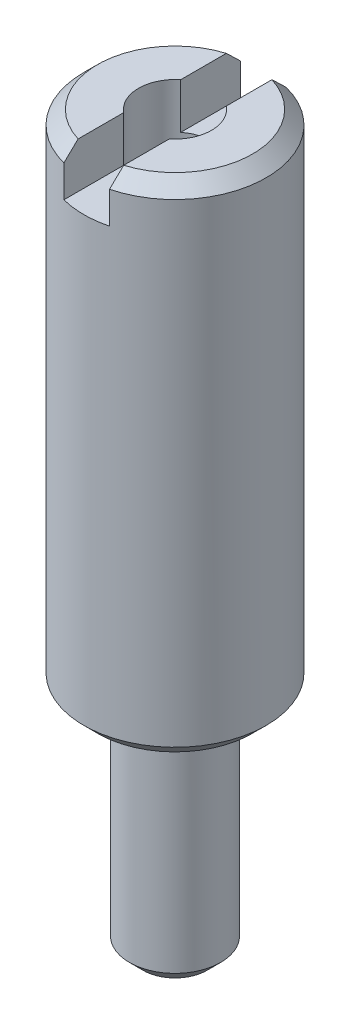
ISO-10303-21;
HEADER;
FILE_DESCRIPTION(('STEP AP214'),'2;1');
FILE_NAME('part.step','',(''),(''),'','','');
FILE_SCHEMA(('AUTOMOTIVE_DESIGN { 1 0 10303 214 1 1 1 1 }'));
ENDSEC;
DATA;
#1=APPLICATION_CONTEXT('core data for automotive mechanical design processes');
#2=APPLICATION_PROTOCOL_DEFINITION('international standard','automotive_design',2000,#1);
#3=PRODUCT_CONTEXT('',#1,'mechanical');
#4=PRODUCT('Part','Part','',(#3));
#5=PRODUCT_RELATED_PRODUCT_CATEGORY('part','',(#4));
#6=PRODUCT_DEFINITION_FORMATION('','',#4);
#7=PRODUCT_DEFINITION_CONTEXT('part definition',#1,'design');
#8=PRODUCT_DEFINITION('design','',#6,#7);
#9=PRODUCT_DEFINITION_SHAPE('','',#8);
#10=(LENGTH_UNIT() NAMED_UNIT(*) SI_UNIT(.MILLI.,.METRE.));
#11=(NAMED_UNIT(*) PLANE_ANGLE_UNIT() SI_UNIT($,.RADIAN.));
#12=(NAMED_UNIT(*) SI_UNIT($,.STERADIAN.) SOLID_ANGLE_UNIT());
#13=UNCERTAINTY_MEASURE_WITH_UNIT(LENGTH_MEASURE(1.E-05),#10,'distance_accuracy_value','');
#14=(GEOMETRIC_REPRESENTATION_CONTEXT(3) GLOBAL_UNCERTAINTY_ASSIGNED_CONTEXT((#13)) GLOBAL_UNIT_ASSIGNED_CONTEXT((#10,
#11,#12)) REPRESENTATION_CONTEXT('',''));
#15=CARTESIAN_POINT('',(0.,0.,0.));
#16=DIRECTION('',(0.,0.,1.));
#17=DIRECTION('',(1.,0.,0.));
#18=AXIS2_PLACEMENT_3D('',#15,#16,#17);
#19=CARTESIAN_POINT('',(0.499999999999999,10.,1.93649167310371));
#20=DIRECTION('',(1.,0.,0.));
#21=DIRECTION('',(0.,1.,0.));
#22=AXIS2_PLACEMENT_3D('',#19,#20,#21);
#23=PLANE('',#22);
#24=DIRECTION('',(0.,0.,-1.));
#25=VECTOR('',#24,1.);
#26=CARTESIAN_POINT('',(0.499999999999999,10.,1.93649167310371));
#27=LINE('',#26,#25);
#28=CARTESIAN_POINT('',(0.499999999999999,10.,-0.624499799839825));
#29=VERTEX_POINT('',#28);
#30=CARTESIAN_POINT('',(0.499999999999999,10.,-1.93649167310371));
#31=VERTEX_POINT('',#30);
#32=EDGE_CURVE('E160',#29,#31,#27,.T.);
#33=ORIENTED_EDGE('',*,*,#32,.F.);
#34=DIRECTION('',(0.,1.,0.));
#35=VECTOR('',#34,1.);
#36=CARTESIAN_POINT('',(0.499999999999999,11.,-0.624499799839825));
#37=LINE('',#36,#35);
#38=CARTESIAN_POINT('',(0.5,11.,-0.624499799839826));
#39=VERTEX_POINT('',#38);
#40=EDGE_CURVE('E139',#29,#39,#37,.T.);
#41=ORIENTED_EDGE('',*,*,#40,.T.);
#42=DIRECTION('',(0.,0.,-1.));
#43=VECTOR('',#42,1.);
#44=CARTESIAN_POINT('',(0.499999999999999,11.,1.93649167310371));
#45=LINE('',#44,#43);
#46=CARTESIAN_POINT('',(0.499999999999999,11.,-1.62480768092719));
#47=VERTEX_POINT('',#46);
#48=EDGE_CURVE('E168',#39,#47,#45,.T.);
#49=ORIENTED_EDGE('',*,*,#48,.T.);
#50=CARTESIAN_POINT('',(0.499999999999999,10.6993222202608,1.93719167310371));
#51=CARTESIAN_POINT('',(0.499999999999999,10.7428770963282,1.89220755731253));
#52=CARTESIAN_POINT('',(0.499999999999999,10.7863850679883,1.84717789776602));
#53=CARTESIAN_POINT('',(0.499999999999999,10.8732800817423,1.75700089805375));
#54=CARTESIAN_POINT('',(0.499999999999999,10.9166671221929,1.71185355630471));
#55=CARTESIAN_POINT('',(0.499999999999999,11.0466536550705,1.5761455190196));
#56=CARTESIAN_POINT('',(0.499999999999999,11.1330289631519,1.48536991040214));
#57=CARTESIAN_POINT('',(0.499999999999999,11.3030075205815,1.30480557239158));
#58=CARTESIAN_POINT('',(0.499999999999999,11.3866309472492,1.21503596615476));
#59=CARTESIAN_POINT('',(0.499999999999999,11.5107449857525,1.07919265928037));
#60=CARTESIAN_POINT('',(0.499999999999999,11.5518912702344,1.03371895804912));
#61=CARTESIAN_POINT('',(0.499999999999999,11.6335486851726,0.942205177900432));
#62=CARTESIAN_POINT('',(0.499999999999999,11.6740598410681,0.89616512180009));
#63=CARTESIAN_POINT('',(0.499999999999999,11.7374263185076,0.822638791086007));
#64=CARTESIAN_POINT('',(0.499999999999999,11.760597051512,0.79542468062398));
#65=CARTESIAN_POINT('',(0.499999999999999,11.806514355603,0.740635407506711));
#66=CARTESIAN_POINT('',(0.499999999999999,11.8292608851979,0.713060209977462));
#67=CARTESIAN_POINT('',(0.499999999999999,11.8744284644168,0.65714775486821));
#68=CARTESIAN_POINT('',(0.499999999999999,11.8968433281294,0.628805479844934));
#69=CARTESIAN_POINT('',(0.499999999999999,11.9408688783991,0.571504126027372));
#70=CARTESIAN_POINT('',(0.499999999999999,11.9624796490216,0.54254511221159));
#71=CARTESIAN_POINT('',(0.499999999999999,12.0048874562061,0.483338483705217));
#72=CARTESIAN_POINT('',(0.499999999999999,12.0256663842913,0.453077774560379));
#73=CARTESIAN_POINT('',(0.499999999999999,12.0654891917586,0.391359158947764));
#74=CARTESIAN_POINT('',(0.499999999999999,12.0845307016714,0.359899698089013));
#75=CARTESIAN_POINT('',(0.499999999999999,12.1196400462383,0.295850013529539));
#76=CARTESIAN_POINT('',(0.499999999999999,12.1357429160322,0.26327948950806));
#77=CARTESIAN_POINT('',(0.499999999999999,12.1636662142921,0.19639463163883));
#78=CARTESIAN_POINT('',(0.499999999999999,12.1755011286258,0.162086655902528));
#79=CARTESIAN_POINT('',(0.499999999999999,12.1922007392071,0.0941284801233588));
#80=CARTESIAN_POINT('',(0.499999999999999,12.1974765424996,0.0605862018063697));
#81=CARTESIAN_POINT('',(0.499999999999999,12.2010782898095,-0.00680451992639368));
#82=CARTESIAN_POINT('',(0.499999999999999,12.1994236436485,-0.0406518437095688));
#83=CARTESIAN_POINT('',(0.499999999999999,12.1897268566969,-0.107052522281991));
#84=CARTESIAN_POINT('',(0.499999999999999,12.181740214835,-0.139614550962263));
#85=CARTESIAN_POINT('',(0.499999999999999,12.1662691375474,-0.187346768125278));
#86=CARTESIAN_POINT('',(0.499999999999999,12.1605065004629,-0.203120360291453));
#87=CARTESIAN_POINT('',(0.499999999999999,12.1480179553612,-0.234279759514601));
#88=CARTESIAN_POINT('',(0.499999999999999,12.1412922505277,-0.249665647564517));
#89=CARTESIAN_POINT('',(0.499999999999999,12.1194868491377,-0.296258315724647));
#90=CARTESIAN_POINT('',(0.499999999999999,12.1031372601359,-0.326867130076432));
#91=CARTESIAN_POINT('',(0.499999999999999,12.068290057956,-0.386849084067541));
#92=CARTESIAN_POINT('',(0.499999999999999,12.0497897379324,-0.416220601772913));
#93=CARTESIAN_POINT('',(0.499999999999999,12.0112948160351,-0.474113366103736));
#94=CARTESIAN_POINT('',(0.499999999999999,11.9912950245838,-0.50263113209238));
#95=CARTESIAN_POINT('',(0.499999999999999,11.9503000497839,-0.558945490941787));
#96=CARTESIAN_POINT('',(0.499999999999999,11.9293046262122,-0.586741907228485));
#97=CARTESIAN_POINT('',(0.499999999999999,11.8647235437807,-0.670031245753593));
#98=CARTESIAN_POINT('',(0.499999999999999,11.8200590176524,-0.724683977764773));
#99=CARTESIAN_POINT('',(0.499999999999999,11.7292857942069,-0.83253300409101));
#100=CARTESIAN_POINT('',(0.499999999999999,11.6831807608361,-0.88573243622847));
#101=CARTESIAN_POINT('',(0.499999999999999,11.5595379698501,-1.02585008394259));
#102=CARTESIAN_POINT('',(0.499999999999999,11.4811811112463,-1.11204372732044));
#103=CARTESIAN_POINT('',(0.499999999999999,11.3231036915184,-1.28331372296256));
#104=CARTESIAN_POINT('',(0.499999999999999,11.2433818717758,-1.36838890021735));
#105=CARTESIAN_POINT('',(0.499999999999999,11.0864558535523,-1.53435066462907));
#106=CARTESIAN_POINT('',(0.499999999999999,11.009282195277,-1.61526614566013));
#107=CARTESIAN_POINT('',(0.499999999999999,10.8545523125568,-1.77655732792672));
#108=CARTESIAN_POINT('',(0.499999999999999,10.776996612147,-1.85693353141052));
#109=CARTESIAN_POINT('',(0.499999999999999,10.6993222202608,-1.93719167310371));
#110=B_SPLINE_CURVE_WITH_KNOTS('',3,(#50,#51,#52,#53,#54,#55,#56,#57,#58,#59,#60,#61,#62,#63,
#64,#65,#66,#67,#68,#69,#70,#71,#72,#73,#74,#75,#76,#77,#78,#79,#80,#81,#82,#83,#84,#85,#86,#87,
#88,#89,#90,#91,#92,#93,#94,#95,#96,#97,#98,#99,#100,#101,#102,#103,#104,#105,#106,#107,#108,
#109),.UNSPECIFIED.,.F.,.F.,(4,2,2,2,2,2,2,2,2,2,2,2,2,2,2,2,2,2,2,2,2,2,2,2,2,2,2,2,2,4),(0.,
0.187844133139613,0.375690806679857,0.751597779356548,1.11963529141073,1.3036097191791,
1.48757675917451,1.59479959408427,1.7020328621595,1.81042655513669,1.91880888389714,
2.02889325193391,2.13912557521411,2.24794285087427,2.35638723428054,2.45762158358788,
2.55857259991711,2.6586484500379,2.70900514357445,2.75935122868917,2.86330447784821,
2.9673900054883,3.07185406100689,3.17634345084378,3.38802536739635,3.59920682721264,
3.94863278075062,4.2984004337216,4.63384936785084,4.96892335170389),.UNSPECIFIED.);
#111=CARTESIAN_POINT('',(0.499999999999999,10.7,-1.93649167310371));
#112=VERTEX_POINT('',#111);
#113=EDGE_CURVE('E212',#47,#112,#110,.T.);
#114=ORIENTED_EDGE('',*,*,#113,.T.);
#115=DIRECTION('',(0.,1.,0.));
#116=VECTOR('',#115,1.);
#117=CARTESIAN_POINT('',(0.499999999999999,10.,-1.93649167310371));
#118=LINE('',#117,#116);
#119=EDGE_CURVE('E171',#31,#112,#118,.T.);
#120=ORIENTED_EDGE('',*,*,#119,.F.);
#121=EDGE_LOOP('',(#33,#41,#49,#114,#120));
#122=FACE_BOUND('',#121,.T.);
#123=ADVANCED_FACE('F49',(#122),#23,.F.);
#124=CARTESIAN_POINT('',(0.,10.,0.));
#125=DIRECTION('',(0.,1.,0.));
#126=DIRECTION('',(-1.,0.,0.));
#127=AXIS2_PLACEMENT_3D('',#124,#125,#126);
#128=PLANE('',#127);
#129=CARTESIAN_POINT('',(0.,10.,0.));
#130=DIRECTION('',(0.,1.,0.));
#131=DIRECTION('',(-1.,0.,0.));
#132=AXIS2_PLACEMENT_3D('',#129,#130,#131);
#133=CIRCLE('',#132,0.799999999999989);
#134=CARTESIAN_POINT('',(-0.500000000000001,10.,0.624499799839825));
#135=VERTEX_POINT('',#134);
#136=CARTESIAN_POINT('',(0.499999999999999,10.,0.624499799839825));
#137=VERTEX_POINT('',#136);
#138=EDGE_CURVE('E141',#135,#137,#133,.T.);
#139=ORIENTED_EDGE('',*,*,#138,.F.);
#140=DIRECTION('',(0.,0.,1.));
#141=VECTOR('',#140,1.);
#142=CARTESIAN_POINT('',(-0.500000000000001,10.,1.93649167310371));
#143=LINE('',#142,#141);
#144=CARTESIAN_POINT('',(-0.500000000000001,10.,1.93649167310371));
#145=VERTEX_POINT('',#144);
#146=EDGE_CURVE('E153',#135,#145,#143,.T.);
#147=ORIENTED_EDGE('',*,*,#146,.T.);
#148=CARTESIAN_POINT('',(0.,10.,0.));
#149=DIRECTION('',(0.,1.,0.));
#150=DIRECTION('',(-1.,0.,0.));
#151=AXIS2_PLACEMENT_3D('',#148,#149,#150);
#152=CIRCLE('',#151,2.);
#153=CARTESIAN_POINT('',(0.499999999999999,10.,1.93649167310371));
#154=VERTEX_POINT('',#153);
#155=EDGE_CURVE('E158',#145,#154,#152,.T.);
#156=ORIENTED_EDGE('',*,*,#155,.T.);
#157=EDGE_CURVE('E161',#154,#137,#27,.T.);
#158=ORIENTED_EDGE('',*,*,#157,.T.);
#159=EDGE_LOOP('',(#139,#147,#156,#158));
#160=FACE_BOUND('',#159,.T.);
#161=ADVANCED_FACE('F257',(#160),#128,.T.);
#162=CARTESIAN_POINT('',(-0.500000000000001,10.,1.93649167310371));
#163=DIRECTION('',(-1.,0.,0.));
#164=DIRECTION('',(0.,-1.,0.));
#165=AXIS2_PLACEMENT_3D('',#162,#163,#164);
#166=PLANE('',#165);
#167=ORIENTED_EDGE('',*,*,#146,.F.);
#168=DIRECTION('',(0.,1.,0.));
#169=VECTOR('',#168,1.);
#170=CARTESIAN_POINT('',(-0.500000000000001,11.,0.624499799839825));
#171=LINE('',#170,#169);
#172=CARTESIAN_POINT('',(-0.500000000000002,11.,0.624499799839826));
#173=VERTEX_POINT('',#172);
#174=EDGE_CURVE('E12',#135,#173,#171,.T.);
#175=ORIENTED_EDGE('',*,*,#174,.T.);
#176=DIRECTION('',(0.,0.,1.));
#177=VECTOR('',#176,1.);
#178=CARTESIAN_POINT('',(-0.500000000000001,11.,1.93649167310371));
#179=LINE('',#178,#177);
#180=CARTESIAN_POINT('',(-0.500000000000001,11.,1.62480768092719));
#181=VERTEX_POINT('',#180);
#182=EDGE_CURVE('E72',#173,#181,#179,.T.);
#183=ORIENTED_EDGE('',*,*,#182,.T.);
#184=CARTESIAN_POINT('',(-0.500000000000001,10.6993222202608,-1.93719167310371));
#185=CARTESIAN_POINT('',(-0.500000000000001,10.7428770963282,-1.89220755731253));
#186=CARTESIAN_POINT('',(-0.500000000000001,10.7863850679883,-1.84717789776602));
#187=CARTESIAN_POINT('',(-0.500000000000001,10.8732800817423,-1.75700089805375));
#188=CARTESIAN_POINT('',(-0.500000000000001,10.9166671221929,-1.71185355630471));
#189=CARTESIAN_POINT('',(-0.500000000000001,11.0466536550705,-1.5761455190196));
#190=CARTESIAN_POINT('',(-0.500000000000001,11.1330289631519,-1.48536991040214));
#191=CARTESIAN_POINT('',(-0.500000000000001,11.3030075205815,-1.30480557239159));
#192=CARTESIAN_POINT('',(-0.500000000000001,11.3866309472492,-1.21503596615477));
#193=CARTESIAN_POINT('',(-0.500000000000001,11.5107449857524,-1.07919265928038));
#194=CARTESIAN_POINT('',(-0.500000000000001,11.5518912702344,-1.03371895804913));
#195=CARTESIAN_POINT('',(-0.500000000000001,11.6335486851726,-0.942205177900439));
#196=CARTESIAN_POINT('',(-0.500000000000001,11.6740598410681,-0.896165121800097));
#197=CARTESIAN_POINT('',(-0.500000000000001,11.7374263185076,-0.822638791086016));
#198=CARTESIAN_POINT('',(-0.500000000000001,11.7605970515119,-0.79542468062399));
#199=CARTESIAN_POINT('',(-0.500000000000001,11.806514355603,-0.740635407506721));
#200=CARTESIAN_POINT('',(-0.500000000000001,11.8292608851979,-0.713060209977471));
#201=CARTESIAN_POINT('',(-0.500000000000001,11.8744284644168,-0.657147754868218));
#202=CARTESIAN_POINT('',(-0.500000000000001,11.8968433281293,-0.628805479844943));
#203=CARTESIAN_POINT('',(-0.500000000000001,11.9408688783991,-0.571504126027379));
#204=CARTESIAN_POINT('',(-0.500000000000001,11.9624796490215,-0.542545112211596));
#205=CARTESIAN_POINT('',(-0.500000000000001,12.0048874562061,-0.483338483705222));
#206=CARTESIAN_POINT('',(-0.500000000000001,12.0256663842912,-0.453077774560384));
#207=CARTESIAN_POINT('',(-0.500000000000001,12.0654891917585,-0.391359158947769));
#208=CARTESIAN_POINT('',(-0.500000000000001,12.0845307016714,-0.359899698089018));
#209=CARTESIAN_POINT('',(-0.500000000000001,12.1196400462383,-0.295850013529543));
#210=CARTESIAN_POINT('',(-0.500000000000001,12.1357429160322,-0.263279489508063));
#211=CARTESIAN_POINT('',(-0.500000000000001,12.1636662142921,-0.196394631638833));
#212=CARTESIAN_POINT('',(-0.500000000000001,12.1755011286258,-0.162086655902531));
#213=CARTESIAN_POINT('',(-0.500000000000001,12.1922007392071,-0.0941284801233621));
#214=CARTESIAN_POINT('',(-0.500000000000001,12.1974765424996,-0.0605862018063727));
#215=CARTESIAN_POINT('',(-0.500000000000001,12.2010782898095,0.0068045199263911));
#216=CARTESIAN_POINT('',(-0.500000000000001,12.1994236436485,0.0406518437095666));
#217=CARTESIAN_POINT('',(-0.500000000000001,12.1897268566969,0.10705252228199));
#218=CARTESIAN_POINT('',(-0.500000000000001,12.181740214835,0.139614550962262));
#219=CARTESIAN_POINT('',(-0.500000000000001,12.1662691375474,0.187346768125277));
#220=CARTESIAN_POINT('',(-0.500000000000001,12.1605065004629,0.203120360291452));
#221=CARTESIAN_POINT('',(-0.500000000000001,12.1480179553612,0.234279759514601));
#222=CARTESIAN_POINT('',(-0.500000000000001,12.1412922505276,0.249665647564517));
#223=CARTESIAN_POINT('',(-0.500000000000001,12.1194868491377,0.296258315724647));
#224=CARTESIAN_POINT('',(-0.500000000000001,12.1031372601359,0.326867130076431));
#225=CARTESIAN_POINT('',(-0.500000000000001,12.068290057956,0.386849084067541));
#226=CARTESIAN_POINT('',(-0.500000000000001,12.0497897379324,0.416220601772914));
#227=CARTESIAN_POINT('',(-0.500000000000001,12.0112948160351,0.474113366103737));
#228=CARTESIAN_POINT('',(-0.500000000000001,11.9912950245838,0.502631132092381));
#229=CARTESIAN_POINT('',(-0.500000000000001,11.9503000497839,0.558945490941788));
#230=CARTESIAN_POINT('',(-0.500000000000001,11.9293046262122,0.586741907228487));
#231=CARTESIAN_POINT('',(-0.500000000000001,11.8647235437807,0.670031245753594));
#232=CARTESIAN_POINT('',(-0.500000000000001,11.8200590176524,0.724683977764773));
#233=CARTESIAN_POINT('',(-0.500000000000001,11.7292857942069,0.832533004091009));
#234=CARTESIAN_POINT('',(-0.500000000000001,11.6831807608361,0.885732436228469));
#235=CARTESIAN_POINT('',(-0.500000000000001,11.5595379698501,1.02585008394259));
#236=CARTESIAN_POINT('',(-0.500000000000001,11.4811811112463,1.11204372732043));
#237=CARTESIAN_POINT('',(-0.500000000000001,11.3231036915184,1.28331372296255));
#238=CARTESIAN_POINT('',(-0.500000000000001,11.2433818717758,1.36838890021735));
#239=CARTESIAN_POINT('',(-0.500000000000001,11.0864558535523,1.53435066462907));
#240=CARTESIAN_POINT('',(-0.500000000000001,11.009282195277,1.61526614566013));
#241=CARTESIAN_POINT('',(-0.500000000000001,10.8545523125568,1.77655732792672));
#242=CARTESIAN_POINT('',(-0.500000000000001,10.776996612147,1.85693353141052));
#243=CARTESIAN_POINT('',(-0.500000000000001,10.6993222202608,1.93719167310371));
#244=B_SPLINE_CURVE_WITH_KNOTS('',3,(#184,#185,#186,#187,#188,#189,#190,#191,#192,#193,#194,
#195,#196,#197,#198,#199,#200,#201,#202,#203,#204,#205,#206,#207,#208,#209,#210,#211,#212,#213,
#214,#215,#216,#217,#218,#219,#220,#221,#222,#223,#224,#225,#226,#227,#228,#229,#230,#231,#232,
#233,#234,#235,#236,#237,#238,#239,#240,#241,#242,#243),.UNSPECIFIED.,.F.,.F.,(4,2,2,2,2,2,2,2,
2,2,2,2,2,2,2,2,2,2,2,2,2,2,2,2,2,2,2,2,2,4),(0.,0.187844133139612,0.375690806679855,
0.751597779356541,1.11963529141071,1.30360971917909,1.4875767591745,1.59479959408425,
1.70203286215949,1.81042655513667,1.91880888389713,2.0288932519339,2.1391255752141,
2.24794285087426,2.35638723428053,2.45762158358787,2.55857259991711,2.6586484500379,
2.70900514357445,2.75935122868916,2.8633044778482,2.9673900054883,3.07185406100689,
3.17634345084378,3.38802536739635,3.59920682721264,3.94863278075062,4.29840043372159,
4.63384936785084,4.96892335170388),.UNSPECIFIED.);
#245=CARTESIAN_POINT('',(-0.500000000000001,10.7,1.93649167310371));
#246=VERTEX_POINT('',#245);
#247=EDGE_CURVE('E203',#181,#246,#244,.T.);
#248=ORIENTED_EDGE('',*,*,#247,.T.);
#249=DIRECTION('',(0.,1.,0.));
#250=VECTOR('',#249,1.);
#251=CARTESIAN_POINT('',(-0.500000000000001,10.,1.93649167310371));
#252=LINE('',#251,#250);
#253=EDGE_CURVE('E177',#145,#246,#252,.T.);
#254=ORIENTED_EDGE('',*,*,#253,.F.);
#255=EDGE_LOOP('',(#167,#175,#183,#248,#254));
#256=FACE_BOUND('',#255,.T.);
#257=ADVANCED_FACE('F229',(#256),#166,.F.);
#258=CARTESIAN_POINT('',(-2.,11.,0.));
#259=DIRECTION('',(0.,1.,0.));
#260=DIRECTION('',(-1.,0.,0.));
#261=AXIS2_PLACEMENT_3D('',#258,#259,#260);
#262=PLANE('',#261);
#263=CARTESIAN_POINT('',(0.,11.,0.));
#264=DIRECTION('',(0.,1.,0.));
#265=DIRECTION('',(0.,0.,1.));
#266=AXIS2_PLACEMENT_3D('',#263,#264,#265);
#267=CIRCLE('',#266,0.79999999999999);
#268=CARTESIAN_POINT('',(0.5,11.,0.624499799839826));
#269=VERTEX_POINT('',#268);
#270=EDGE_CURVE('E137',#269,#39,#267,.T.);
#271=ORIENTED_EDGE('',*,*,#270,.F.);
#272=CARTESIAN_POINT('',(0.499999999999999,11.,1.62480768092719));
#273=VERTEX_POINT('',#272);
#274=EDGE_CURVE('E154',#273,#269,#45,.T.);
#275=ORIENTED_EDGE('',*,*,#274,.F.);
#276=CARTESIAN_POINT('',(0.,11.,0.));
#277=DIRECTION('',(0.,1.,0.));
#278=DIRECTION('',(-1.,0.,0.));
#279=AXIS2_PLACEMENT_3D('',#276,#277,#278);
#280=CIRCLE('',#279,1.7);
#281=EDGE_CURVE('E186',#273,#47,#280,.T.);
#282=ORIENTED_EDGE('',*,*,#281,.T.);
#283=ORIENTED_EDGE('',*,*,#48,.F.);
#284=EDGE_LOOP('',(#271,#275,#282,#283));
#285=FACE_BOUND('',#284,.T.);
#286=ADVANCED_FACE('F237',(#285),#262,.T.);
#287=CARTESIAN_POINT('',(0.,11.,0.));
#288=DIRECTION('',(0.,-1.,0.));
#289=DIRECTION('',(1.,0.,0.));
#290=AXIS2_PLACEMENT_3D('',#287,#288,#289);
#291=CONICAL_SURFACE('',#290,1.7,0.785398163397447);
#292=CARTESIAN_POINT('',(0.499999999999999,10.7,1.93649167310371));
#293=VERTEX_POINT('',#292);
#294=EDGE_CURVE('E274',#293,#273,#110,.T.);
#295=ORIENTED_EDGE('',*,*,#294,.F.);
#296=CARTESIAN_POINT('',(0.,10.7,0.));
#297=DIRECTION('',(0.,1.,0.));
#298=DIRECTION('',(-1.,0.,0.));
#299=AXIS2_PLACEMENT_3D('',#296,#297,#298);
#300=CIRCLE('',#299,2.);
#301=EDGE_CURVE('E193',#112,#293,#300,.F.);
#302=ORIENTED_EDGE('',*,*,#301,.F.);
#303=ORIENTED_EDGE('',*,*,#113,.F.);
#304=ORIENTED_EDGE('',*,*,#281,.F.);
#305=EDGE_LOOP('',(#295,#302,#303,#304));
#306=FACE_BOUND('',#305,.T.);
#307=ADVANCED_FACE('F250',(#306),#291,.T.);
#308=CARTESIAN_POINT('',(0.,-5.,0.));
#309=DIRECTION('',(0.,-1.,0.));
#310=DIRECTION('',(1.,0.,0.));
#311=AXIS2_PLACEMENT_3D('',#308,#309,#310);
#312=PLANE('',#311);
#313=CARTESIAN_POINT('',(0.,-5.,0.));
#314=DIRECTION('',(0.,-1.,0.));
#315=DIRECTION('',(1.,0.,0.));
#316=AXIS2_PLACEMENT_3D('',#313,#314,#315);
#317=CIRCLE('',#316,0.7);
#318=CARTESIAN_POINT('',(0.700000000000002,-5.,0.));
#319=VERTEX_POINT('',#318);
#320=EDGE_CURVE('E200',#319,#319,#317,.T.);
#321=ORIENTED_EDGE('',*,*,#320,.T.);
#322=EDGE_LOOP('',(#321));
#323=FACE_BOUND('',#322,.T.);
#324=ADVANCED_FACE('F247',(#323),#312,.T.);
#325=CARTESIAN_POINT('',(0.,16.004822161942,0.));
#326=DIRECTION('',(0.,1.,0.));
#327=DIRECTION('',(-1.,0.,0.));
#328=AXIS2_PLACEMENT_3D('',#325,#326,#327);
#329=CYLINDRICAL_SURFACE('',#328,1.);
#330=CARTESIAN_POINT('',(0.,-4.7,0.));
#331=DIRECTION('',(0.,-1.,0.));
#332=DIRECTION('',(1.,0.,0.));
#333=AXIS2_PLACEMENT_3D('',#330,#331,#332);
#334=CIRCLE('',#333,1.);
#335=CARTESIAN_POINT('',(1.,-4.7,0.));
#336=VERTEX_POINT('',#335);
#337=EDGE_CURVE('E197',#336,#336,#334,.F.);
#338=ORIENTED_EDGE('',*,*,#337,.T.);
#339=EDGE_LOOP('',(#338));
#340=FACE_BOUND('',#339,.T.);
#341=CARTESIAN_POINT('',(0.,0.,0.));
#342=DIRECTION('',(0.,1.,0.));
#343=DIRECTION('',(-1.,0.,0.));
#344=AXIS2_PLACEMENT_3D('',#341,#342,#343);
#345=CIRCLE('',#344,1.);
#346=CARTESIAN_POINT('',(-1.,0.,0.));
#347=VERTEX_POINT('',#346);
#348=EDGE_CURVE('E174',#347,#347,#345,.T.);
#349=ORIENTED_EDGE('',*,*,#348,.F.);
#350=EDGE_LOOP('',(#349));
#351=FACE_BOUND('',#350,.T.);
#352=ADVANCED_FACE('F244',(#340,#351),#329,.T.);
#353=CARTESIAN_POINT('',(-1.,0.,0.));
#354=DIRECTION('',(0.,-1.,0.));
#355=DIRECTION('',(1.,0.,0.));
#356=AXIS2_PLACEMENT_3D('',#353,#354,#355);
#357=PLANE('',#356);
#358=CARTESIAN_POINT('',(0.,0.,0.));
#359=DIRECTION('',(0.,-1.,0.));
#360=DIRECTION('',(1.,0.,0.));
#361=AXIS2_PLACEMENT_3D('',#358,#359,#360);
#362=CIRCLE('',#361,1.69999999999999);
#363=CARTESIAN_POINT('',(-1.69999999999999,0.,0.));
#364=VERTEX_POINT('',#363);
#365=EDGE_CURVE('E194',#364,#364,#362,.T.);
#366=ORIENTED_EDGE('',*,*,#365,.T.);
#367=EDGE_LOOP('',(#366));
#368=FACE_BOUND('',#367,.T.);
#369=ORIENTED_EDGE('',*,*,#348,.T.);
#370=EDGE_LOOP('',(#369));
#371=FACE_BOUND('',#370,.T.);
#372=ADVANCED_FACE('F240',(#368,#371),#357,.T.);
#373=CARTESIAN_POINT('',(0.,16.004822161942,0.));
#374=DIRECTION('',(0.,1.,0.));
#375=DIRECTION('',(-1.,0.,0.));
#376=AXIS2_PLACEMENT_3D('',#373,#374,#375);
#377=CYLINDRICAL_SURFACE('',#376,2.);
#378=ORIENTED_EDGE('',*,*,#119,.T.);
#379=ORIENTED_EDGE('',*,*,#301,.T.);
#380=DIRECTION('',(0.,1.,0.));
#381=VECTOR('',#380,1.);
#382=CARTESIAN_POINT('',(0.499999999999999,10.,1.93649167310371));
#383=LINE('',#382,#381);
#384=EDGE_CURVE('E175',#154,#293,#383,.T.);
#385=ORIENTED_EDGE('',*,*,#384,.F.);
#386=ORIENTED_EDGE('',*,*,#155,.F.);
#387=ORIENTED_EDGE('',*,*,#253,.T.);
#388=CARTESIAN_POINT('',(-0.500000000000001,10.7,-1.93649167310371));
#389=VERTEX_POINT('',#388);
#390=EDGE_CURVE('E190',#246,#389,#300,.F.);
#391=ORIENTED_EDGE('',*,*,#390,.T.);
#392=DIRECTION('',(0.,1.,0.));
#393=VECTOR('',#392,1.);
#394=CARTESIAN_POINT('',(-0.500000000000001,10.,-1.93649167310371));
#395=LINE('',#394,#393);
#396=CARTESIAN_POINT('',(-0.500000000000001,10.,-1.93649167310371));
#397=VERTEX_POINT('',#396);
#398=EDGE_CURVE('E164',#397,#389,#395,.T.);
#399=ORIENTED_EDGE('',*,*,#398,.F.);
#400=CARTESIAN_POINT('',(0.,10.,0.));
#401=DIRECTION('',(0.,1.,0.));
#402=DIRECTION('',(-1.,0.,0.));
#403=AXIS2_PLACEMENT_3D('',#400,#401,#402);
#404=CIRCLE('',#403,2.);
#405=EDGE_CURVE('E150',#31,#397,#404,.T.);
#406=ORIENTED_EDGE('',*,*,#405,.F.);
#407=EDGE_LOOP('',(#378,#379,#385,#386,#387,#391,#399,#406));
#408=FACE_BOUND('',#407,.T.);
#409=CARTESIAN_POINT('',(0.,0.300000000000005,0.));
#410=DIRECTION('',(0.,-1.,0.));
#411=DIRECTION('',(1.,0.,0.));
#412=AXIS2_PLACEMENT_3D('',#409,#410,#411);
#413=CIRCLE('',#412,2.);
#414=CARTESIAN_POINT('',(-2.,0.300000000000005,0.));
#415=VERTEX_POINT('',#414);
#416=EDGE_CURVE('E187',#415,#415,#413,.F.);
#417=ORIENTED_EDGE('',*,*,#416,.T.);
#418=EDGE_LOOP('',(#417));
#419=FACE_BOUND('',#418,.T.);
#420=ADVANCED_FACE('F235',(#408,#419),#377,.T.);
#421=CARTESIAN_POINT('',(-0.500000000000002,11.,-0.624499799839826));
#422=VERTEX_POINT('',#421);
#423=EDGE_CURVE('E142',#422,#173,#267,.T.);
#424=ORIENTED_EDGE('',*,*,#423,.F.);
#425=CARTESIAN_POINT('',(-0.500000000000001,11.,-1.62480768092719));
#426=VERTEX_POINT('',#425);
#427=EDGE_CURVE('E165',#426,#422,#179,.T.);
#428=ORIENTED_EDGE('',*,*,#427,.F.);
#429=EDGE_CURVE('E183',#426,#181,#280,.T.);
#430=ORIENTED_EDGE('',*,*,#429,.T.);
#431=ORIENTED_EDGE('',*,*,#182,.F.);
#432=EDGE_LOOP('',(#424,#428,#430,#431));
#433=FACE_BOUND('',#432,.T.);
#434=ADVANCED_FACE('F232',(#433),#262,.T.);
#435=EDGE_CURVE('E211',#389,#426,#244,.T.);
#436=ORIENTED_EDGE('',*,*,#435,.F.);
#437=ORIENTED_EDGE('',*,*,#390,.F.);
#438=ORIENTED_EDGE('',*,*,#247,.F.);
#439=ORIENTED_EDGE('',*,*,#429,.F.);
#440=EDGE_LOOP('',(#436,#437,#438,#439));
#441=FACE_BOUND('',#440,.T.);
#442=ADVANCED_FACE('F219',(#441),#291,.T.);
#443=CARTESIAN_POINT('',(0.,0.300000000000005,0.));
#444=DIRECTION('',(0.,1.,0.));
#445=DIRECTION('',(-1.,0.,0.));
#446=AXIS2_PLACEMENT_3D('',#443,#444,#445);
#447=CONICAL_SURFACE('',#446,2.,0.785398163397447);
#448=CARTESIAN_POINT('',(-1.69999999999999,0.,0.));
#449=CARTESIAN_POINT('',(-1.70312499999999,0.00312499999999992,0.));
#450=CARTESIAN_POINT('',(-1.70624999999999,0.00624999999999998,0.));
#451=CARTESIAN_POINT('',(-1.71249999999999,0.0125000000000001,0.));
#452=CARTESIAN_POINT('',(-1.71562499999999,0.0156250000000001,0.));
#453=CARTESIAN_POINT('',(-1.72187499999999,0.0218750000000003,0.));
#454=CARTESIAN_POINT('',(-1.72499999999999,0.0250000000000003,0.));
#455=CARTESIAN_POINT('',(-1.73124999999999,0.0312500000000004,0.));
#456=CARTESIAN_POINT('',(-1.73437499999999,0.0343750000000005,0.));
#457=CARTESIAN_POINT('',(-1.74062499999999,0.0406250000000006,0.));
#458=CARTESIAN_POINT('',(-1.74374999999999,0.0437500000000006,0.));
#459=CARTESIAN_POINT('',(-1.74999999999999,0.0500000000000007,0.));
#460=CARTESIAN_POINT('',(-1.75312499999999,0.0531250000000008,0.));
#461=CARTESIAN_POINT('',(-1.75937499999999,0.0593750000000009,0.));
#462=CARTESIAN_POINT('',(-1.76249999999999,0.0625000000000009,0.));
#463=CARTESIAN_POINT('',(-1.76874999999999,0.068750000000001,0.));
#464=CARTESIAN_POINT('',(-1.77187499999999,0.0718750000000011,0.));
#465=CARTESIAN_POINT('',(-1.77812499999999,0.0781250000000012,0.));
#466=CARTESIAN_POINT('',(-1.78124999999999,0.0812500000000013,0.));
#467=CARTESIAN_POINT('',(-1.78749999999999,0.0875000000000014,0.));
#468=CARTESIAN_POINT('',(-1.79062499999999,0.0906250000000014,0.));
#469=CARTESIAN_POINT('',(-1.79687499999999,0.0968750000000015,0.));
#470=CARTESIAN_POINT('',(-1.79999999999999,0.100000000000002,0.));
#471=CARTESIAN_POINT('',(-1.80624999999999,0.106250000000002,0.));
#472=CARTESIAN_POINT('',(-1.80937499999999,0.109375000000002,0.));
#473=CARTESIAN_POINT('',(-1.81562499999999,0.115625000000002,0.));
#474=CARTESIAN_POINT('',(-1.81874999999999,0.118750000000002,0.));
#475=CARTESIAN_POINT('',(-1.82499999999999,0.125000000000002,0.));
#476=CARTESIAN_POINT('',(-1.82812499999999,0.128125000000002,0.));
#477=CARTESIAN_POINT('',(-1.83437499999999,0.134375000000002,0.));
#478=CARTESIAN_POINT('',(-1.8375,0.137500000000002,0.));
#479=CARTESIAN_POINT('',(-1.84375,0.143750000000002,0.));
#480=CARTESIAN_POINT('',(-1.84687499999999,0.146875000000002,0.));
#481=CARTESIAN_POINT('',(-1.853125,0.153125000000002,0.));
#482=CARTESIAN_POINT('',(-1.85625,0.156250000000003,0.));
#483=CARTESIAN_POINT('',(-1.8625,0.162500000000003,0.));
#484=CARTESIAN_POINT('',(-1.865625,0.165625000000003,0.));
#485=CARTESIAN_POINT('',(-1.871875,0.171875000000003,0.));
#486=CARTESIAN_POINT('',(-1.875,0.175000000000003,0.));
#487=CARTESIAN_POINT('',(-1.88125,0.181250000000003,0.));
#488=CARTESIAN_POINT('',(-1.884375,0.184375000000003,0.));
#489=CARTESIAN_POINT('',(-1.890625,0.190625000000003,0.));
#490=CARTESIAN_POINT('',(-1.89375,0.193750000000003,0.));
#491=CARTESIAN_POINT('',(-1.9,0.200000000000003,0.));
#492=CARTESIAN_POINT('',(-1.903125,0.203125000000003,0.));
#493=CARTESIAN_POINT('',(-1.909375,0.209375000000003,0.));
#494=CARTESIAN_POINT('',(-1.9125,0.212500000000003,0.));
#495=CARTESIAN_POINT('',(-1.91875,0.218750000000004,0.));
#496=CARTESIAN_POINT('',(-1.921875,0.221875000000004,0.));
#497=CARTESIAN_POINT('',(-1.928125,0.228125000000004,0.));
#498=CARTESIAN_POINT('',(-1.93125,0.231250000000004,0.));
#499=CARTESIAN_POINT('',(-1.9375,0.237500000000004,0.));
#500=CARTESIAN_POINT('',(-1.940625,0.240625000000004,0.));
#501=CARTESIAN_POINT('',(-1.946875,0.246875000000004,0.));
#502=CARTESIAN_POINT('',(-1.95,0.250000000000004,0.));
#503=CARTESIAN_POINT('',(-1.95625,0.256250000000004,0.));
#504=CARTESIAN_POINT('',(-1.959375,0.259375000000004,0.));
#505=CARTESIAN_POINT('',(-1.965625,0.265625000000004,0.));
#506=CARTESIAN_POINT('',(-1.96875,0.268750000000004,0.));
#507=CARTESIAN_POINT('',(-1.975,0.275000000000004,0.));
#508=CARTESIAN_POINT('',(-1.978125,0.278125000000005,0.));
#509=CARTESIAN_POINT('',(-1.984375,0.284375000000005,0.));
#510=CARTESIAN_POINT('',(-1.9875,0.287500000000005,0.));
#511=CARTESIAN_POINT('',(-1.99375,0.293750000000005,0.));
#512=CARTESIAN_POINT('',(-1.996875,0.296875000000005,0.));
#513=CARTESIAN_POINT('',(-2.,0.300000000000005,0.));
#514=B_SPLINE_CURVE_WITH_KNOTS('',3,(#448,#449,#450,#451,#452,#453,#454,#455,#456,#457,#458,
#459,#460,#461,#462,#463,#464,#465,#466,#467,#468,#469,#470,#471,#472,#473,#474,#475,#476,#477,
#478,#479,#480,#481,#482,#483,#484,#485,#486,#487,#488,#489,#490,#491,#492,#493,#494,#495,#496,
#497,#498,#499,#500,#501,#502,#503,#504,#505,#506,#507,#508,#509,#510,#511,#512,#513),
.UNSPECIFIED.,.F.,.F.,(4,2,2,2,2,2,2,2,2,2,2,2,2,2,2,2,2,2,2,2,2,2,2,2,2,2,2,2,2,2,2,2,4),(0.,
0.0132582521472481,0.026516504294496,0.0397747564417439,0.053033008588992,0.0662912607362399,
0.0795495128834878,0.0928077650307358,0.106066017177984,0.119324269325232,0.13258252147248,
0.145840773619728,0.159099025766976,0.172357277914224,0.185615530061472,0.19887378220872,
0.212132034355968,0.225390286503215,0.238648538650464,0.251906790797711,0.265165042944959,
0.278423295092207,0.291681547239455,0.304939799386703,0.318198051533951,0.331456303681199,
0.344714555828447,0.357972807975695,0.371231060122943,0.384489312270191,0.397747564417439,
0.411005816564687,0.424264068711935),.UNSPECIFIED.);
#515=EDGE_CURVE('BSEAM269',#364,#415,#514,.T.);
#516=ORIENTED_EDGE('',*,*,#365,.F.);
#517=ORIENTED_EDGE('',*,*,#416,.F.);
#518=ORIENTED_EDGE('',*,*,#515,.T.);
#519=ORIENTED_EDGE('',*,*,#515,.F.);
#520=EDGE_LOOP('',(#516,#518,#517,#519));
#521=FACE_BOUND('',#520,.T.);
#522=ADVANCED_FACE('F269',(#521),#447,.T.);
#523=CARTESIAN_POINT('',(0.,-4.7,0.));
#524=DIRECTION('',(0.,1.,0.));
#525=DIRECTION('',(-1.,0.,0.));
#526=AXIS2_PLACEMENT_3D('',#523,#524,#525);
#527=CONICAL_SURFACE('',#526,1.,0.785398163397449);
#528=ORIENTED_EDGE('',*,*,#320,.F.);
#529=EDGE_LOOP('',(#528));
#530=FACE_BOUND('',#529,.T.);
#531=ORIENTED_EDGE('',*,*,#337,.F.);
#532=EDGE_LOOP('',(#531));
#533=FACE_BOUND('',#532,.T.);
#534=ADVANCED_FACE('F52',(#530,#533),#527,.T.);
#535=ORIENTED_EDGE('',*,*,#274,.T.);
#536=DIRECTION('',(0.,1.,0.));
#537=VECTOR('',#536,1.);
#538=CARTESIAN_POINT('',(0.499999999999999,11.,0.624499799839825));
#539=LINE('',#538,#537);
#540=EDGE_CURVE('E147',#269,#137,#539,.F.);
#541=ORIENTED_EDGE('',*,*,#540,.T.);
#542=ORIENTED_EDGE('',*,*,#157,.F.);
#543=ORIENTED_EDGE('',*,*,#384,.T.);
#544=ORIENTED_EDGE('',*,*,#294,.T.);
#545=EDGE_LOOP('',(#535,#541,#542,#543,#544));
#546=FACE_BOUND('',#545,.T.);
#547=ADVANCED_FACE('F227',(#546),#23,.F.);
#548=ORIENTED_EDGE('',*,*,#427,.T.);
#549=DIRECTION('',(0.,1.,0.));
#550=VECTOR('',#549,1.);
#551=CARTESIAN_POINT('',(-0.500000000000001,11.,-0.624499799839825));
#552=LINE('',#551,#550);
#553=CARTESIAN_POINT('',(-0.500000000000001,10.,-0.624499799839824));
#554=VERTEX_POINT('',#553);
#555=EDGE_CURVE('E58',#422,#554,#552,.F.);
#556=ORIENTED_EDGE('',*,*,#555,.T.);
#557=EDGE_CURVE('E155',#397,#554,#143,.T.);
#558=ORIENTED_EDGE('',*,*,#557,.F.);
#559=ORIENTED_EDGE('',*,*,#398,.T.);
#560=ORIENTED_EDGE('',*,*,#435,.T.);
#561=EDGE_LOOP('',(#548,#556,#558,#559,#560));
#562=FACE_BOUND('',#561,.T.);
#563=ADVANCED_FACE('F222',(#562),#166,.F.);
#564=EDGE_CURVE('E65',#29,#554,#133,.T.);
#565=ORIENTED_EDGE('',*,*,#564,.F.);
#566=ORIENTED_EDGE('',*,*,#32,.T.);
#567=ORIENTED_EDGE('',*,*,#405,.T.);
#568=ORIENTED_EDGE('',*,*,#557,.T.);
#569=EDGE_LOOP('',(#565,#566,#567,#568));
#570=FACE_BOUND('',#569,.T.);
#571=ADVANCED_FACE('F226',(#570),#128,.T.);
#572=CARTESIAN_POINT('',(0.,11.,0.));
#573=DIRECTION('',(0.,1.,0.));
#574=DIRECTION('',(0.,0.,1.));
#575=AXIS2_PLACEMENT_3D('',#572,#573,#574);
#576=CYLINDRICAL_SURFACE('',#575,0.799999999999989);
#577=CARTESIAN_POINT('',(0.,2.99999999999999,0.));
#578=DIRECTION('',(0.,1.,0.));
#579=DIRECTION('',(0.,0.,1.));
#580=AXIS2_PLACEMENT_3D('',#577,#578,#579);
#581=CIRCLE('',#580,0.799999999999988);
#582=CARTESIAN_POINT('',(0.,2.99999999999999,0.799999999999988));
#583=VERTEX_POINT('',#582);
#584=EDGE_CURVE('E135',#583,#583,#581,.T.);
#585=ORIENTED_EDGE('',*,*,#584,.F.);
#586=EDGE_LOOP('',(#585));
#587=FACE_BOUND('',#586,.T.);
#588=ORIENTED_EDGE('',*,*,#138,.T.);
#589=ORIENTED_EDGE('',*,*,#540,.F.);
#590=ORIENTED_EDGE('',*,*,#270,.T.);
#591=ORIENTED_EDGE('',*,*,#40,.F.);
#592=ORIENTED_EDGE('',*,*,#564,.T.);
#593=ORIENTED_EDGE('',*,*,#555,.F.);
#594=ORIENTED_EDGE('',*,*,#423,.T.);
#595=ORIENTED_EDGE('',*,*,#174,.F.);
#596=EDGE_LOOP('',(#588,#589,#590,#591,#592,#593,#594,#595));
#597=FACE_BOUND('',#596,.T.);
#598=ADVANCED_FACE('F131',(#587,#597),#576,.F.);
#599=CARTESIAN_POINT('',(0.,2.99999999999999,0.));
#600=DIRECTION('',(0.,1.,0.));
#601=DIRECTION('',(0.,0.,1.));
#602=AXIS2_PLACEMENT_3D('',#599,#600,#601);
#603=CONICAL_SURFACE('',#602,0.799999999999988,1.02974425867665);
#604=CARTESIAN_POINT('',(0.,2.51931150477795,0.));
#605=VERTEX_POINT('',#604);
#606=VERTEX_LOOP('',#605);
#607=FACE_BOUND('',#606,.T.);
#608=ORIENTED_EDGE('',*,*,#584,.T.);
#609=EDGE_LOOP('',(#608));
#610=FACE_BOUND('',#609,.T.);
#611=ADVANCED_FACE('F128',(#607,#610),#603,.F.);
#612=CLOSED_SHELL('',(#123,#161,#257,#286,#307,#324,#352,#372,#420,#434,#442,#522,#534,#547,
#563,#571,#598,#611));
#613=MANIFOLD_SOLID_BREP('B2',#612);
#614=ADVANCED_BREP_SHAPE_REPRESENTATION('',(#18,#613),#14);
#615=SHAPE_DEFINITION_REPRESENTATION(#9,#614);
ENDSEC;
END-ISO-10303-21;
